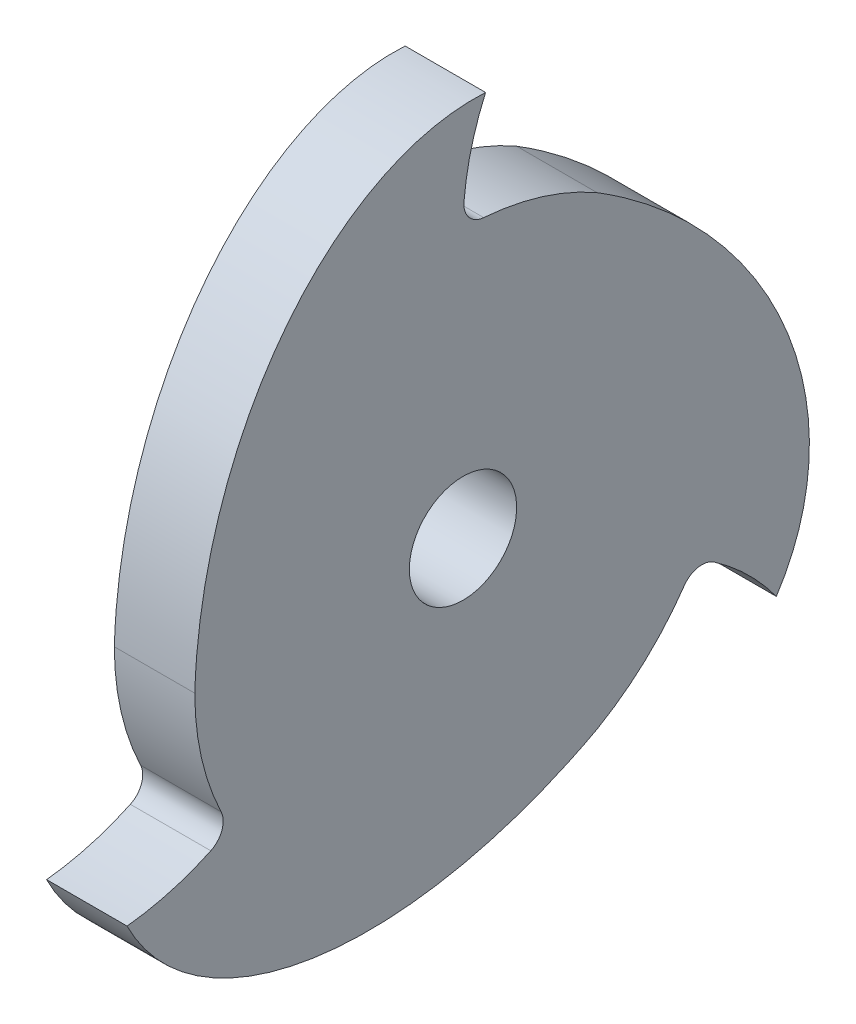
ISO-10303-21;
HEADER;
FILE_DESCRIPTION(('STEP AP214'),'2;1');
FILE_NAME('part.step','',(''),(''),'','','');
FILE_SCHEMA(('AUTOMOTIVE_DESIGN { 1 0 10303 214 1 1 1 1 }'));
ENDSEC;
DATA;
#1=APPLICATION_CONTEXT('core data for automotive mechanical design processes');
#2=APPLICATION_PROTOCOL_DEFINITION('international standard','automotive_design',2000,#1);
#3=PRODUCT_CONTEXT('',#1,'mechanical');
#4=PRODUCT('Part','Part','',(#3));
#5=PRODUCT_RELATED_PRODUCT_CATEGORY('part','',(#4));
#6=PRODUCT_DEFINITION_FORMATION('','',#4);
#7=PRODUCT_DEFINITION_CONTEXT('part definition',#1,'design');
#8=PRODUCT_DEFINITION('design','',#6,#7);
#9=PRODUCT_DEFINITION_SHAPE('','',#8);
#10=(LENGTH_UNIT() NAMED_UNIT(*) SI_UNIT(.MILLI.,.METRE.));
#11=(NAMED_UNIT(*) PLANE_ANGLE_UNIT() SI_UNIT($,.RADIAN.));
#12=(NAMED_UNIT(*) SI_UNIT($,.STERADIAN.) SOLID_ANGLE_UNIT());
#13=UNCERTAINTY_MEASURE_WITH_UNIT(LENGTH_MEASURE(1.E-05),#10,'distance_accuracy_value','');
#14=(GEOMETRIC_REPRESENTATION_CONTEXT(3) GLOBAL_UNCERTAINTY_ASSIGNED_CONTEXT((#13)) GLOBAL_UNIT_ASSIGNED_CONTEXT((#10,
#11,#12)) REPRESENTATION_CONTEXT('',''));
#15=CARTESIAN_POINT('',(0.,0.,0.));
#16=DIRECTION('',(0.,0.,1.));
#17=DIRECTION('',(1.,0.,0.));
#18=AXIS2_PLACEMENT_3D('',#15,#16,#17);
#19=CARTESIAN_POINT('',(9.525,31.75,-31.1085197333464));
#20=DIRECTION('',(-1.,0.,0.));
#21=DIRECTION('',(0.,0.,1.));
#22=AXIS2_PLACEMENT_3D('',#19,#20,#21);
#23=CYLINDRICAL_SURFACE('',#22,31.1085197333463);
#24=CARTESIAN_POINT('',(9.525,31.75,-31.1085197333464));
#25=DIRECTION('',(1.,0.,0.));
#26=DIRECTION('',(0.,0.,-1.));
#27=AXIS2_PLACEMENT_3D('',#24,#25,#26);
#28=CIRCLE('',#27,31.1085197333463);
#29=CARTESIAN_POINT('',(9.525,34.4046474268232,-0.113474209274933));
#30=VERTEX_POINT('',#29);
#31=CARTESIAN_POINT('',(9.525,44.3694618592576,-2.67457554013355));
#32=VERTEX_POINT('',#31);
#33=EDGE_CURVE('E132',#30,#32,#28,.F.);
#34=ORIENTED_EDGE('',*,*,#33,.F.);
#35=DIRECTION('',(-1.,0.,0.));
#36=VECTOR('',#35,1.);
#37=CARTESIAN_POINT('',(9.525,34.4046474268232,-0.113474209274943));
#38=LINE('',#37,#36);
#39=CARTESIAN_POINT('',(0.,34.4046474268232,-0.113474209274933));
#40=VERTEX_POINT('',#39);
#41=EDGE_CURVE('E180',#30,#40,#38,.T.);
#42=ORIENTED_EDGE('',*,*,#41,.T.);
#43=CARTESIAN_POINT('',(0.,31.75,-31.1085197333464));
#44=DIRECTION('',(1.,0.,0.));
#45=DIRECTION('',(0.,0.,-1.));
#46=AXIS2_PLACEMENT_3D('',#43,#44,#45);
#47=CIRCLE('',#46,31.1085197333463);
#48=CARTESIAN_POINT('',(0.,44.3694618592576,-2.67457554013355));
#49=VERTEX_POINT('',#48);
#50=EDGE_CURVE('E157',#40,#49,#47,.F.);
#51=ORIENTED_EDGE('',*,*,#50,.T.);
#52=DIRECTION('',(-1.,0.,0.));
#53=VECTOR('',#52,1.);
#54=CARTESIAN_POINT('',(9.525,44.3694618592576,-2.67457554013355));
#55=LINE('',#54,#53);
#56=EDGE_CURVE('E150',#32,#49,#55,.T.);
#57=ORIENTED_EDGE('',*,*,#56,.F.);
#58=EDGE_LOOP('',(#34,#42,#51,#57));
#59=FACE_BOUND('',#58,.T.);
#60=ADVANCED_FACE('F43',(#59),#23,.F.);
#61=CARTESIAN_POINT('',(9.525,0.,0.));
#62=DIRECTION('',(1.,0.,0.));
#63=DIRECTION('',(0.,0.998188118318507,-0.0601704283494615));
#64=AXIS2_PLACEMENT_3D('',#61,#62,#63);
#65=ELLIPSE('',#64,44.45,31.7217842834486);
#66=DIRECTION('',(-1.,0.,0.));
#67=VECTOR('',#66,1.);
#68=SURFACE_OF_LINEAR_EXTRUSION('',#65,#67);
#69=CARTESIAN_POINT('',(0.,0.,0.));
#70=DIRECTION('',(1.,0.,0.));
#71=DIRECTION('',(0.,0.998188118318507,-0.0601704283494615));
#72=AXIS2_PLACEMENT_3D('',#69,#70,#71);
#73=ELLIPSE('',#72,44.45,31.7217842834486);
#74=CARTESIAN_POINT('',(0.,1.27393755267047E-13,31.75));
#75=VERTEX_POINT('',#74);
#76=EDGE_CURVE('E245',#49,#75,#73,.T.);
#77=ORIENTED_EDGE('',*,*,#76,.T.);
#78=DIRECTION('',(-1.,0.,0.));
#79=VECTOR('',#78,1.);
#80=CARTESIAN_POINT('',(9.525,1.27393755267047E-13,31.75));
#81=LINE('',#80,#79);
#82=CARTESIAN_POINT('',(9.525,1.27393755267047E-13,31.75));
#83=VERTEX_POINT('',#82);
#84=EDGE_CURVE('E152',#83,#75,#81,.T.);
#85=ORIENTED_EDGE('',*,*,#84,.F.);
#86=EDGE_CURVE('E137',#32,#83,#65,.T.);
#87=ORIENTED_EDGE('',*,*,#86,.F.);
#88=ORIENTED_EDGE('',*,*,#56,.T.);
#89=EDGE_LOOP('',(#77,#85,#87,#88));
#90=FACE_BOUND('',#89,.T.);
#91=ADVANCED_FACE('F149',(#90),#68,.F.);
#92=CARTESIAN_POINT('',(9.525,0.,0.));
#93=DIRECTION('',(-1.,0.,0.));
#94=DIRECTION('',(0.,0.,1.));
#95=AXIS2_PLACEMENT_3D('',#92,#93,#94);
#96=CYLINDRICAL_SURFACE('',#95,31.75);
#97=CARTESIAN_POINT('',(0.,0.,0.));
#98=DIRECTION('',(1.,0.,0.));
#99=DIRECTION('',(0.,0.,-1.));
#100=AXIS2_PLACEMENT_3D('',#97,#98,#99);
#101=CIRCLE('',#100,31.75);
#102=CARTESIAN_POINT('',(0.,-13.7074036581491,28.6386030551869));
#103=VERTEX_POINT('',#102);
#104=EDGE_CURVE('E233',#75,#103,#101,.T.);
#105=ORIENTED_EDGE('',*,*,#104,.T.);
#106=DIRECTION('',(-1.,0.,0.));
#107=VECTOR('',#106,1.);
#108=CARTESIAN_POINT('',(9.525,-13.7074036581491,28.6386030551869));
#109=LINE('',#108,#107);
#110=CARTESIAN_POINT('',(9.525,-13.7074036581491,28.6386030551869));
#111=VERTEX_POINT('',#110);
#112=EDGE_CURVE('E165',#103,#111,#109,.F.);
#113=ORIENTED_EDGE('',*,*,#112,.T.);
#114=CARTESIAN_POINT('',(9.525,0.,0.));
#115=DIRECTION('',(1.,0.,0.));
#116=DIRECTION('',(0.,0.,-1.));
#117=AXIS2_PLACEMENT_3D('',#114,#115,#116);
#118=CIRCLE('',#117,31.75);
#119=EDGE_CURVE('E155',#83,#111,#118,.T.);
#120=ORIENTED_EDGE('',*,*,#119,.F.);
#121=ORIENTED_EDGE('',*,*,#84,.T.);
#122=EDGE_LOOP('',(#105,#113,#120,#121));
#123=FACE_BOUND('',#122,.T.);
#124=ADVANCED_FACE('F309',(#123),#96,.T.);
#125=CARTESIAN_POINT('',(9.525,11.0657683632075,43.0505664368291));
#126=DIRECTION('',(-1.,0.,0.));
#127=DIRECTION('',(0.,0.,1.));
#128=AXIS2_PLACEMENT_3D('',#125,#126,#127);
#129=CYLINDRICAL_SURFACE('',#128,31.1085197333464);
#130=CARTESIAN_POINT('',(9.525,11.0657683632075,43.0505664368291));
#131=DIRECTION('',(1.,0.,0.));
#132=DIRECTION('',(0.,0.,-1.));
#133=AXIS2_PLACEMENT_3D('',#130,#131,#132);
#134=CIRCLE('',#133,31.1085197333464);
#135=CARTESIAN_POINT('',(9.525,-17.1040521655052,29.8520357845133));
#136=VERTEX_POINT('',#135);
#137=CARTESIAN_POINT('',(9.525,-19.8684805675327,39.7623688924286));
#138=VERTEX_POINT('',#137);
#139=EDGE_CURVE('E302',#136,#138,#134,.F.);
#140=ORIENTED_EDGE('',*,*,#139,.F.);
#141=DIRECTION('',(-1.,0.,0.));
#142=VECTOR('',#141,1.);
#143=CARTESIAN_POINT('',(9.525,-17.1040521655052,29.8520357845133));
#144=LINE('',#143,#142);
#145=CARTESIAN_POINT('',(0.,-17.1040521655052,29.8520357845133));
#146=VERTEX_POINT('',#145);
#147=EDGE_CURVE('E160',#136,#146,#144,.T.);
#148=ORIENTED_EDGE('',*,*,#147,.T.);
#149=CARTESIAN_POINT('',(0.,11.0657683632075,43.0505664368291));
#150=DIRECTION('',(1.,0.,0.));
#151=DIRECTION('',(0.,0.,-1.));
#152=AXIS2_PLACEMENT_3D('',#149,#150,#151);
#153=CIRCLE('',#152,31.1085197333464);
#154=CARTESIAN_POINT('',(0.,-19.8684805675327,39.7623688924286));
#155=VERTEX_POINT('',#154);
#156=EDGE_CURVE('E239',#146,#155,#153,.F.);
#157=ORIENTED_EDGE('',*,*,#156,.T.);
#158=DIRECTION('',(-1.,0.,0.));
#159=VECTOR('',#158,1.);
#160=CARTESIAN_POINT('',(9.525,-19.8684805675327,39.7623688924286));
#161=LINE('',#160,#159);
#162=EDGE_CURVE('E167',#138,#155,#161,.T.);
#163=ORIENTED_EDGE('',*,*,#162,.F.);
#164=EDGE_LOOP('',(#140,#148,#157,#163));
#165=FACE_BOUND('',#164,.T.);
#166=ADVANCED_FACE('F297',(#165),#129,.F.);
#167=CARTESIAN_POINT('',(9.525,0.,0.));
#168=DIRECTION('',(1.,0.,0.));
#169=DIRECTION('',(0.,-0.446984939652029,0.894541482394345));
#170=AXIS2_PLACEMENT_3D('',#167,#168,#169);
#171=ELLIPSE('',#170,44.45,31.7217842834486);
#172=DIRECTION('',(-1.,0.,0.));
#173=VECTOR('',#172,1.);
#174=SURFACE_OF_LINEAR_EXTRUSION('',#171,#173);
#175=CARTESIAN_POINT('',(0.,0.,0.));
#176=DIRECTION('',(1.,0.,0.));
#177=DIRECTION('',(0.,-0.446984939652029,0.894541482394345));
#178=AXIS2_PLACEMENT_3D('',#175,#176,#177);
#179=ELLIPSE('',#178,44.45,31.7217842834486);
#180=CARTESIAN_POINT('',(0.,-27.4963065701558,-15.8750000000001));
#181=VERTEX_POINT('',#180);
#182=EDGE_CURVE('E231',#155,#181,#179,.T.);
#183=ORIENTED_EDGE('',*,*,#182,.T.);
#184=DIRECTION('',(-1.,0.,0.));
#185=VECTOR('',#184,1.);
#186=CARTESIAN_POINT('',(9.525,-27.4963065701558,-15.8750000000001));
#187=LINE('',#186,#185);
#188=CARTESIAN_POINT('',(9.525,-27.4963065701558,-15.8750000000001));
#189=VERTEX_POINT('',#188);
#190=EDGE_CURVE('E229',#189,#181,#187,.T.);
#191=ORIENTED_EDGE('',*,*,#190,.F.);
#192=EDGE_CURVE('E269',#138,#189,#171,.T.);
#193=ORIENTED_EDGE('',*,*,#192,.F.);
#194=ORIENTED_EDGE('',*,*,#162,.T.);
#195=EDGE_LOOP('',(#183,#191,#193,#194));
#196=FACE_BOUND('',#195,.T.);
#197=ADVANCED_FACE('F268',(#196),#174,.F.);
#198=CARTESIAN_POINT('',(0.,-17.948055945616,-26.1902613154783));
#199=VERTEX_POINT('',#198);
#200=EDGE_CURVE('E222',#181,#199,#101,.T.);
#201=ORIENTED_EDGE('',*,*,#200,.T.);
#202=DIRECTION('',(-1.,0.,0.));
#203=VECTOR('',#202,1.);
#204=CARTESIAN_POINT('',(9.525,-17.948055945616,-26.1902613154783));
#205=LINE('',#204,#203);
#206=CARTESIAN_POINT('',(9.525,-17.948055945616,-26.1902613154783));
#207=VERTEX_POINT('',#206);
#208=EDGE_CURVE('E177',#199,#207,#205,.F.);
#209=ORIENTED_EDGE('',*,*,#208,.T.);
#210=EDGE_CURVE('E203',#189,#207,#118,.T.);
#211=ORIENTED_EDGE('',*,*,#210,.F.);
#212=ORIENTED_EDGE('',*,*,#190,.T.);
#213=EDGE_LOOP('',(#201,#209,#211,#212));
#214=FACE_BOUND('',#213,.T.);
#215=ADVANCED_FACE('F227',(#214),#96,.T.);
#216=CARTESIAN_POINT('',(9.525,-42.8157683632075,-11.9420467034828));
#217=DIRECTION('',(-1.,0.,0.));
#218=DIRECTION('',(0.,0.,1.));
#219=AXIS2_PLACEMENT_3D('',#216,#217,#218);
#220=CYLINDRICAL_SURFACE('',#219,31.1085197333463);
#221=CARTESIAN_POINT('',(9.525,-42.8157683632075,-11.9420467034828));
#222=DIRECTION('',(1.,0.,0.));
#223=DIRECTION('',(0.,0.,-1.));
#224=AXIS2_PLACEMENT_3D('',#221,#222,#223);
#225=CIRCLE('',#224,31.1085197333463);
#226=CARTESIAN_POINT('',(9.525,-17.300595261318,-29.7385615752384));
#227=VERTEX_POINT('',#226);
#228=CARTESIAN_POINT('',(9.525,-24.5009812917249,-37.0877933522951));
#229=VERTEX_POINT('',#228);
#230=EDGE_CURVE('E200',#227,#229,#225,.F.);
#231=ORIENTED_EDGE('',*,*,#230,.F.);
#232=DIRECTION('',(-1.,0.,0.));
#233=VECTOR('',#232,1.);
#234=CARTESIAN_POINT('',(9.525,-17.3005952613181,-29.7385615752384));
#235=LINE('',#234,#233);
#236=CARTESIAN_POINT('',(0.,-17.300595261318,-29.7385615752384));
#237=VERTEX_POINT('',#236);
#238=EDGE_CURVE('E173',#227,#237,#235,.T.);
#239=ORIENTED_EDGE('',*,*,#238,.T.);
#240=CARTESIAN_POINT('',(0.,-42.8157683632075,-11.9420467034828));
#241=DIRECTION('',(1.,0.,0.));
#242=DIRECTION('',(0.,0.,-1.));
#243=AXIS2_PLACEMENT_3D('',#240,#241,#242);
#244=CIRCLE('',#243,31.1085197333463);
#245=CARTESIAN_POINT('',(0.,-24.5009812917249,-37.0877933522951));
#246=VERTEX_POINT('',#245);
#247=EDGE_CURVE('E224',#237,#246,#244,.F.);
#248=ORIENTED_EDGE('',*,*,#247,.T.);
#249=DIRECTION('',(-1.,0.,0.));
#250=VECTOR('',#249,1.);
#251=CARTESIAN_POINT('',(9.525,-24.5009812917249,-37.0877933522951));
#252=LINE('',#251,#250);
#253=EDGE_CURVE('E211',#229,#246,#252,.T.);
#254=ORIENTED_EDGE('',*,*,#253,.F.);
#255=EDGE_LOOP('',(#231,#239,#248,#254));
#256=FACE_BOUND('',#255,.T.);
#257=ADVANCED_FACE('F208',(#256),#220,.F.);
#258=CARTESIAN_POINT('',(9.525,0.,0.));
#259=DIRECTION('',(1.,0.,0.));
#260=DIRECTION('',(0.,-0.551203178666478,-0.834371054044884));
#261=AXIS2_PLACEMENT_3D('',#258,#259,#260);
#262=ELLIPSE('',#261,44.45,31.7217842834486);
#263=DIRECTION('',(-1.,0.,0.));
#264=VECTOR('',#263,1.);
#265=SURFACE_OF_LINEAR_EXTRUSION('',#262,#264);
#266=CARTESIAN_POINT('',(0.,0.,0.));
#267=DIRECTION('',(1.,0.,0.));
#268=DIRECTION('',(0.,-0.551203178666478,-0.834371054044884));
#269=AXIS2_PLACEMENT_3D('',#266,#267,#268);
#270=ELLIPSE('',#269,44.45,31.7217842834486);
#271=CARTESIAN_POINT('',(0.,27.4963065701558,-15.8750000000003));
#272=VERTEX_POINT('',#271);
#273=EDGE_CURVE('E237',#246,#272,#270,.T.);
#274=ORIENTED_EDGE('',*,*,#273,.T.);
#275=DIRECTION('',(-1.,0.,0.));
#276=VECTOR('',#275,1.);
#277=CARTESIAN_POINT('',(9.525,27.4963065701558,-15.8750000000003));
#278=LINE('',#277,#276);
#279=CARTESIAN_POINT('',(9.525,27.4963065701558,-15.8750000000003));
#280=VERTEX_POINT('',#279);
#281=EDGE_CURVE('E256',#280,#272,#278,.T.);
#282=ORIENTED_EDGE('',*,*,#281,.F.);
#283=EDGE_CURVE('E214',#229,#280,#262,.T.);
#284=ORIENTED_EDGE('',*,*,#283,.F.);
#285=ORIENTED_EDGE('',*,*,#253,.T.);
#286=EDGE_LOOP('',(#274,#282,#284,#285));
#287=FACE_BOUND('',#286,.T.);
#288=ADVANCED_FACE('F287',(#287),#265,.F.);
#289=CARTESIAN_POINT('',(0.,31.655459603765,-2.44834173970861));
#290=VERTEX_POINT('',#289);
#291=EDGE_CURVE('E234',#272,#290,#101,.T.);
#292=ORIENTED_EDGE('',*,*,#291,.T.);
#293=DIRECTION('',(-1.,0.,0.));
#294=VECTOR('',#293,1.);
#295=CARTESIAN_POINT('',(9.525,31.655459603765,-2.44834173970861));
#296=LINE('',#295,#294);
#297=CARTESIAN_POINT('',(9.525,31.655459603765,-2.44834173970861));
#298=VERTEX_POINT('',#297);
#299=EDGE_CURVE('E59',#290,#298,#296,.F.);
#300=ORIENTED_EDGE('',*,*,#299,.T.);
#301=EDGE_CURVE('E282',#280,#298,#118,.T.);
#302=ORIENTED_EDGE('',*,*,#301,.F.);
#303=ORIENTED_EDGE('',*,*,#281,.T.);
#304=EDGE_LOOP('',(#292,#300,#302,#303));
#305=FACE_BOUND('',#304,.T.);
#306=ADVANCED_FACE('F291',(#305),#96,.T.);
#307=CARTESIAN_POINT('',(9.525,0.,0.));
#308=DIRECTION('',(-1.,0.,0.));
#309=DIRECTION('',(0.,0.,1.));
#310=AXIS2_PLACEMENT_3D('',#307,#308,#309);
#311=CYLINDRICAL_SURFACE('',#310,6.35);
#312=CARTESIAN_POINT('',(9.525,0.,0.));
#313=DIRECTION('',(1.,0.,0.));
#314=DIRECTION('',(0.,0.,-1.));
#315=AXIS2_PLACEMENT_3D('',#312,#313,#314);
#316=CIRCLE('',#315,6.35);
#317=CARTESIAN_POINT('',(9.525,0.,6.35));
#318=VERTEX_POINT('',#317);
#319=EDGE_CURVE('E259',#318,#318,#316,.T.);
#320=CARTESIAN_POINT('',(0.,0.,0.));
#321=DIRECTION('',(1.,0.,0.));
#322=DIRECTION('',(0.,0.,-1.));
#323=AXIS2_PLACEMENT_3D('',#320,#321,#322);
#324=CIRCLE('',#323,6.35);
#325=CARTESIAN_POINT('',(0.,0.,6.35));
#326=VERTEX_POINT('',#325);
#327=EDGE_CURVE('E145',#326,#326,#324,.T.);
#328=CARTESIAN_POINT('',(9.525,0.,6.35));
#329=CARTESIAN_POINT('',(9.42578125,0.,6.35));
#330=CARTESIAN_POINT('',(9.3265625,0.,6.35));
#331=CARTESIAN_POINT('',(9.128125,0.,6.35));
#332=CARTESIAN_POINT('',(9.02890625,0.,6.35));
#333=CARTESIAN_POINT('',(8.83046875,0.,6.35));
#334=CARTESIAN_POINT('',(8.73125,0.,6.35));
#335=CARTESIAN_POINT('',(8.5328125,0.,6.35));
#336=CARTESIAN_POINT('',(8.43359375,0.,6.35));
#337=CARTESIAN_POINT('',(8.23515625,0.,6.35));
#338=CARTESIAN_POINT('',(8.1359375,0.,6.35));
#339=CARTESIAN_POINT('',(7.9375,0.,6.35));
#340=CARTESIAN_POINT('',(7.83828125,0.,6.35));
#341=CARTESIAN_POINT('',(7.63984375,0.,6.35));
#342=CARTESIAN_POINT('',(7.540625,0.,6.35));
#343=CARTESIAN_POINT('',(7.3421875,0.,6.35));
#344=CARTESIAN_POINT('',(7.24296875,0.,6.35));
#345=CARTESIAN_POINT('',(7.04453125,0.,6.35));
#346=CARTESIAN_POINT('',(6.9453125,0.,6.35));
#347=CARTESIAN_POINT('',(6.746875,0.,6.35));
#348=CARTESIAN_POINT('',(6.64765625,0.,6.35));
#349=CARTESIAN_POINT('',(6.44921875,0.,6.35));
#350=CARTESIAN_POINT('',(6.35,0.,6.35));
#351=CARTESIAN_POINT('',(6.1515625,0.,6.35));
#352=CARTESIAN_POINT('',(6.05234375,0.,6.35));
#353=CARTESIAN_POINT('',(5.85390625,0.,6.35));
#354=CARTESIAN_POINT('',(5.7546875,0.,6.35));
#355=CARTESIAN_POINT('',(5.55625,0.,6.35));
#356=CARTESIAN_POINT('',(5.45703125,0.,6.35));
#357=CARTESIAN_POINT('',(5.25859375,0.,6.35));
#358=CARTESIAN_POINT('',(5.159375,0.,6.35));
#359=CARTESIAN_POINT('',(4.9609375,0.,6.35));
#360=CARTESIAN_POINT('',(4.86171875,0.,6.35));
#361=CARTESIAN_POINT('',(4.66328125,0.,6.35));
#362=CARTESIAN_POINT('',(4.5640625,0.,6.35));
#363=CARTESIAN_POINT('',(4.365625,0.,6.35));
#364=CARTESIAN_POINT('',(4.26640625,0.,6.35));
#365=CARTESIAN_POINT('',(4.06796875,0.,6.35));
#366=CARTESIAN_POINT('',(3.96875,0.,6.35));
#367=CARTESIAN_POINT('',(3.7703125,0.,6.35));
#368=CARTESIAN_POINT('',(3.67109375,0.,6.35));
#369=CARTESIAN_POINT('',(3.47265625,0.,6.35));
#370=CARTESIAN_POINT('',(3.3734375,0.,6.35));
#371=CARTESIAN_POINT('',(3.175,0.,6.35));
#372=CARTESIAN_POINT('',(3.07578125,0.,6.35));
#373=CARTESIAN_POINT('',(2.87734375,0.,6.35));
#374=CARTESIAN_POINT('',(2.778125,0.,6.35));
#375=CARTESIAN_POINT('',(2.5796875,0.,6.35));
#376=CARTESIAN_POINT('',(2.48046875,0.,6.35));
#377=CARTESIAN_POINT('',(2.28203125,0.,6.35));
#378=CARTESIAN_POINT('',(2.1828125,0.,6.35));
#379=CARTESIAN_POINT('',(1.984375,0.,6.35));
#380=CARTESIAN_POINT('',(1.88515625,0.,6.35));
#381=CARTESIAN_POINT('',(1.68671875,0.,6.35));
#382=CARTESIAN_POINT('',(1.5875,0.,6.35));
#383=CARTESIAN_POINT('',(1.3890625,0.,6.35));
#384=CARTESIAN_POINT('',(1.28984375,0.,6.35));
#385=CARTESIAN_POINT('',(1.09140625,0.,6.35));
#386=CARTESIAN_POINT('',(0.992187500000001,0.,6.35));
#387=CARTESIAN_POINT('',(0.793750000000001,0.,6.35));
#388=CARTESIAN_POINT('',(0.69453125,0.,6.35));
#389=CARTESIAN_POINT('',(0.49609375,0.,6.35));
#390=CARTESIAN_POINT('',(0.396875,0.,6.35));
#391=CARTESIAN_POINT('',(0.1984375,0.,6.35));
#392=CARTESIAN_POINT('',(0.0992187500000001,0.,6.35));
#393=CARTESIAN_POINT('',(0.,0.,6.35));
#394=B_SPLINE_CURVE_WITH_KNOTS('',3,(#328,#329,#330,#331,#332,#333,#334,#335,#336,#337,#338,
#339,#340,#341,#342,#343,#344,#345,#346,#347,#348,#349,#350,#351,#352,#353,#354,#355,#356,#357,
#358,#359,#360,#361,#362,#363,#364,#365,#366,#367,#368,#369,#370,#371,#372,#373,#374,#375,#376,
#377,#378,#379,#380,#381,#382,#383,#384,#385,#386,#387,#388,#389,#390,#391,#392,#393),
.UNSPECIFIED.,.F.,.F.,(4,2,2,2,2,2,2,2,2,2,2,2,2,2,2,2,2,2,2,2,2,2,2,2,2,2,2,2,2,2,2,2,4),(0.,
0.297656249999998,0.595312499999999,0.892968749999999,1.190625,1.48828125,1.7859375,2.08359375,
2.38125,2.67890625,2.9765625,3.27421875,3.571875,3.86953125,4.1671875,4.46484375,4.7625,
5.06015625,5.3578125,5.65546875,5.953125,6.25078125,6.5484375,6.84609375,7.14375,7.44140625,
7.7390625,8.03671875,8.334375,8.63203125,8.9296875,9.22734375,9.525),.UNSPECIFIED.);
#395=EDGE_CURVE('BSEAM329',#318,#326,#394,.T.);
#396=ORIENTED_EDGE('',*,*,#319,.T.);
#397=ORIENTED_EDGE('',*,*,#327,.F.);
#398=ORIENTED_EDGE('',*,*,#395,.T.);
#399=ORIENTED_EDGE('',*,*,#395,.F.);
#400=EDGE_LOOP('',(#396,#398,#397,#399));
#401=FACE_BOUND('',#400,.T.);
#402=ADVANCED_FACE('F329',(#401),#311,.F.);
#403=CARTESIAN_POINT('',(9.525,0.,0.));
#404=DIRECTION('',(1.,0.,0.));
#405=DIRECTION('',(0.,0.,-1.));
#406=AXIS2_PLACEMENT_3D('',#403,#404,#405);
#407=PLANE('',#406);
#408=ORIENTED_EDGE('',*,*,#301,.T.);
#409=CARTESIAN_POINT('',(9.525,34.1878963720662,-2.6442090788853));
#410=DIRECTION('',(1.,0.,0.));
#411=DIRECTION('',(0.,0.,-1.));
#412=AXIS2_PLACEMENT_3D('',#409,#410,#411);
#413=CIRCLE('',#412,2.54);
#414=EDGE_CURVE('E11',#298,#30,#413,.F.);
#415=ORIENTED_EDGE('',*,*,#414,.T.);
#416=ORIENTED_EDGE('',*,*,#33,.T.);
#417=ORIENTED_EDGE('',*,*,#86,.T.);
#418=ORIENTED_EDGE('',*,*,#119,.T.);
#419=CARTESIAN_POINT('',(9.525,-14.803995950801,30.9296912996019));
#420=DIRECTION('',(1.,0.,0.));
#421=DIRECTION('',(0.,0.,-1.));
#422=AXIS2_PLACEMENT_3D('',#419,#420,#421);
#423=CIRCLE('',#422,2.54);
#424=EDGE_CURVE('E188',#111,#136,#423,.F.);
#425=ORIENTED_EDGE('',*,*,#424,.T.);
#426=ORIENTED_EDGE('',*,*,#139,.T.);
#427=ORIENTED_EDGE('',*,*,#192,.T.);
#428=ORIENTED_EDGE('',*,*,#210,.T.);
#429=CARTESIAN_POINT('',(9.525,-19.3839004212652,-28.2854822207166));
#430=DIRECTION('',(1.,0.,0.));
#431=DIRECTION('',(0.,0.,-1.));
#432=AXIS2_PLACEMENT_3D('',#429,#430,#431);
#433=CIRCLE('',#432,2.54);
#434=EDGE_CURVE('E194',#207,#227,#433,.F.);
#435=ORIENTED_EDGE('',*,*,#434,.T.);
#436=ORIENTED_EDGE('',*,*,#230,.T.);
#437=ORIENTED_EDGE('',*,*,#283,.T.);
#438=EDGE_LOOP('',(#408,#415,#416,#417,#418,#425,#426,#427,#428,#435,#436,#437));
#439=FACE_BOUND('',#438,.T.);
#440=ORIENTED_EDGE('',*,*,#319,.F.);
#441=EDGE_LOOP('',(#440));
#442=FACE_BOUND('',#441,.T.);
#443=ADVANCED_FACE('F134',(#439,#442),#407,.T.);
#444=CARTESIAN_POINT('',(0.,0.,0.));
#445=DIRECTION('',(1.,0.,0.));
#446=DIRECTION('',(0.,0.,-1.));
#447=AXIS2_PLACEMENT_3D('',#444,#445,#446);
#448=PLANE('',#447);
#449=ORIENTED_EDGE('',*,*,#50,.F.);
#450=CARTESIAN_POINT('',(0.,34.1878963720662,-2.6442090788853));
#451=DIRECTION('',(1.,0.,0.));
#452=DIRECTION('',(0.,0.,-1.));
#453=AXIS2_PLACEMENT_3D('',#450,#451,#452);
#454=CIRCLE('',#453,2.54);
#455=EDGE_CURVE('E52',#40,#290,#454,.T.);
#456=ORIENTED_EDGE('',*,*,#455,.T.);
#457=ORIENTED_EDGE('',*,*,#291,.F.);
#458=ORIENTED_EDGE('',*,*,#273,.F.);
#459=ORIENTED_EDGE('',*,*,#247,.F.);
#460=CARTESIAN_POINT('',(0.,-19.3839004212652,-28.2854822207166));
#461=DIRECTION('',(1.,0.,0.));
#462=DIRECTION('',(0.,0.,-1.));
#463=AXIS2_PLACEMENT_3D('',#460,#461,#462);
#464=CIRCLE('',#463,2.54);
#465=EDGE_CURVE('E191',#237,#199,#464,.T.);
#466=ORIENTED_EDGE('',*,*,#465,.T.);
#467=ORIENTED_EDGE('',*,*,#200,.F.);
#468=ORIENTED_EDGE('',*,*,#182,.F.);
#469=ORIENTED_EDGE('',*,*,#156,.F.);
#470=CARTESIAN_POINT('',(0.,-14.803995950801,30.9296912996019));
#471=DIRECTION('',(1.,0.,0.));
#472=DIRECTION('',(0.,0.,-1.));
#473=AXIS2_PLACEMENT_3D('',#470,#471,#472);
#474=CIRCLE('',#473,2.54);
#475=EDGE_CURVE('E185',#146,#103,#474,.T.);
#476=ORIENTED_EDGE('',*,*,#475,.T.);
#477=ORIENTED_EDGE('',*,*,#104,.F.);
#478=ORIENTED_EDGE('',*,*,#76,.F.);
#479=EDGE_LOOP('',(#449,#456,#457,#458,#459,#466,#467,#468,#469,#476,#477,#478));
#480=FACE_BOUND('',#479,.T.);
#481=ORIENTED_EDGE('',*,*,#327,.T.);
#482=EDGE_LOOP('',(#481));
#483=FACE_BOUND('',#482,.T.);
#484=ADVANCED_FACE('F219',(#480,#483),#448,.F.);
#485=CARTESIAN_POINT('',(9.525,-14.803995950801,30.9296912996019));
#486=DIRECTION('',(-1.,0.,0.));
#487=DIRECTION('',(0.,0.,1.));
#488=AXIS2_PLACEMENT_3D('',#485,#486,#487);
#489=CYLINDRICAL_SURFACE('',#488,2.54);
#490=ORIENTED_EDGE('',*,*,#424,.F.);
#491=ORIENTED_EDGE('',*,*,#112,.F.);
#492=ORIENTED_EDGE('',*,*,#475,.F.);
#493=ORIENTED_EDGE('',*,*,#147,.F.);
#494=EDGE_LOOP('',(#490,#491,#492,#493));
#495=FACE_BOUND('',#494,.T.);
#496=ADVANCED_FACE('F312',(#495),#489,.F.);
#497=CARTESIAN_POINT('',(9.525,-19.3839004212652,-28.2854822207166));
#498=DIRECTION('',(-1.,0.,0.));
#499=DIRECTION('',(0.,0.,1.));
#500=AXIS2_PLACEMENT_3D('',#497,#498,#499);
#501=CYLINDRICAL_SURFACE('',#500,2.54);
#502=ORIENTED_EDGE('',*,*,#434,.F.);
#503=ORIENTED_EDGE('',*,*,#208,.F.);
#504=ORIENTED_EDGE('',*,*,#465,.F.);
#505=ORIENTED_EDGE('',*,*,#238,.F.);
#506=EDGE_LOOP('',(#502,#503,#504,#505));
#507=FACE_BOUND('',#506,.T.);
#508=ADVANCED_FACE('F216',(#507),#501,.F.);
#509=CARTESIAN_POINT('',(9.525,34.1878963720662,-2.6442090788853));
#510=DIRECTION('',(-1.,0.,0.));
#511=DIRECTION('',(0.,0.,1.));
#512=AXIS2_PLACEMENT_3D('',#509,#510,#511);
#513=CYLINDRICAL_SURFACE('',#512,2.54);
#514=ORIENTED_EDGE('',*,*,#414,.F.);
#515=ORIENTED_EDGE('',*,*,#299,.F.);
#516=ORIENTED_EDGE('',*,*,#455,.F.);
#517=ORIENTED_EDGE('',*,*,#41,.F.);
#518=EDGE_LOOP('',(#514,#515,#516,#517));
#519=FACE_BOUND('',#518,.T.);
#520=ADVANCED_FACE('F45',(#519),#513,.F.);
#521=CLOSED_SHELL('',(#60,#91,#124,#166,#197,#215,#257,#288,#306,#402,#443,#484,#496,#508,#520));
#522=MANIFOLD_SOLID_BREP('B2',#521);
#523=ADVANCED_BREP_SHAPE_REPRESENTATION('',(#18,#522),#14);
#524=SHAPE_DEFINITION_REPRESENTATION(#9,#523);
ENDSEC;
END-ISO-10303-21;
